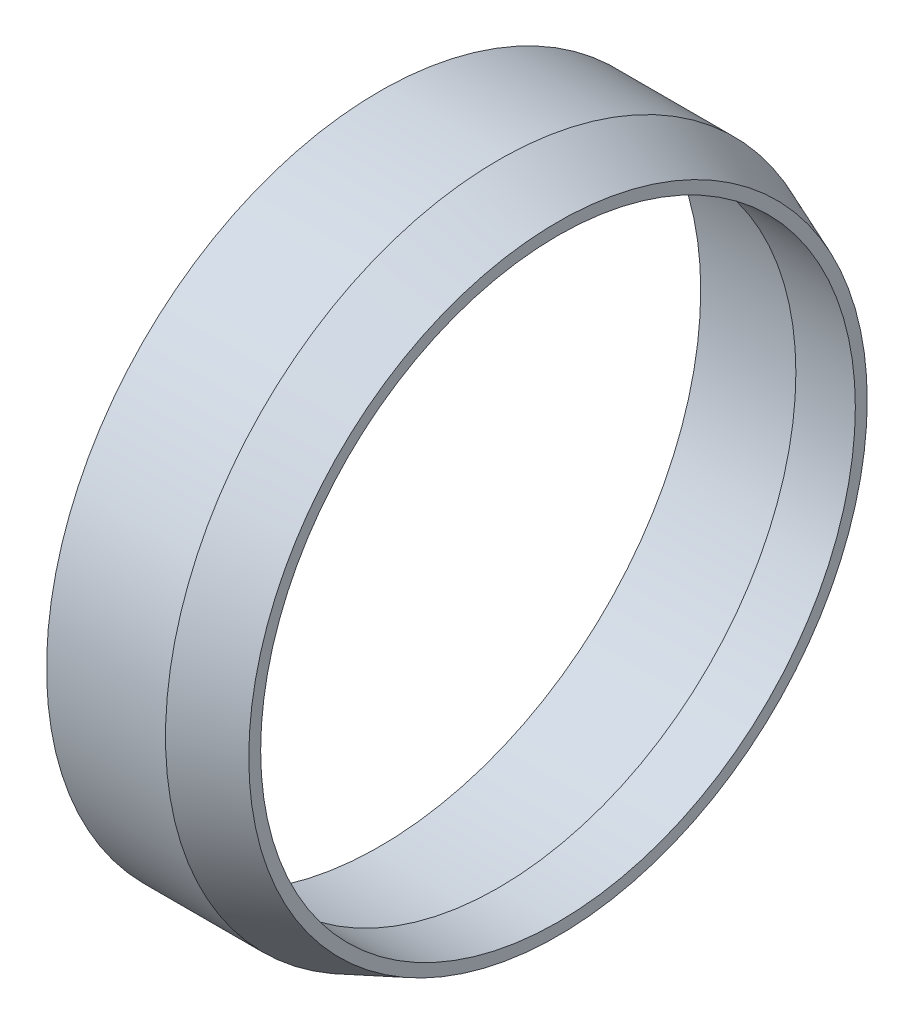
ISO-10303-21;
HEADER;
FILE_DESCRIPTION(('STEP AP214'),'2;1');
FILE_NAME('part.step','',(''),(''),'','','');
FILE_SCHEMA(('AUTOMOTIVE_DESIGN { 1 0 10303 214 1 1 1 1 }'));
ENDSEC;
DATA;
#1=APPLICATION_CONTEXT('core data for automotive mechanical design processes');
#2=APPLICATION_PROTOCOL_DEFINITION('international standard','automotive_design',2000,#1);
#3=PRODUCT_CONTEXT('',#1,'mechanical');
#4=PRODUCT('Part','Part','',(#3));
#5=PRODUCT_RELATED_PRODUCT_CATEGORY('part','',(#4));
#6=PRODUCT_DEFINITION_FORMATION('','',#4);
#7=PRODUCT_DEFINITION_CONTEXT('part definition',#1,'design');
#8=PRODUCT_DEFINITION('design','',#6,#7);
#9=PRODUCT_DEFINITION_SHAPE('','',#8);
#10=(LENGTH_UNIT() NAMED_UNIT(*) SI_UNIT(.MILLI.,.METRE.));
#11=(NAMED_UNIT(*) PLANE_ANGLE_UNIT() SI_UNIT($,.RADIAN.));
#12=(NAMED_UNIT(*) SI_UNIT($,.STERADIAN.) SOLID_ANGLE_UNIT());
#13=UNCERTAINTY_MEASURE_WITH_UNIT(LENGTH_MEASURE(1.E-05),#10,'distance_accuracy_value','');
#14=(GEOMETRIC_REPRESENTATION_CONTEXT(3) GLOBAL_UNCERTAINTY_ASSIGNED_CONTEXT((#13)) GLOBAL_UNIT_ASSIGNED_CONTEXT((#10,
#11,#12)) REPRESENTATION_CONTEXT('',''));
#15=CARTESIAN_POINT('',(0.,0.,0.));
#16=DIRECTION('',(0.,0.,1.));
#17=DIRECTION('',(1.,0.,0.));
#18=AXIS2_PLACEMENT_3D('',#15,#16,#17);
#19=CARTESIAN_POINT('',(37.9005030329932,0.,0.));
#20=DIRECTION('',(1.,0.,0.));
#21=DIRECTION('',(0.,0.,-1.));
#22=AXIS2_PLACEMENT_3D('',#19,#20,#21);
#23=CYLINDRICAL_SURFACE('',#22,25.);
#24=CARTESIAN_POINT('',(0.,0.,0.));
#25=DIRECTION('',(1.,0.,0.));
#26=DIRECTION('',(0.,0.,-1.));
#27=AXIS2_PLACEMENT_3D('',#24,#25,#26);
#28=CIRCLE('',#27,25.);
#29=CARTESIAN_POINT('',(0.,0.,-25.));
#30=VERTEX_POINT('',#29);
#31=EDGE_CURVE('E10',#30,#30,#28,.T.);
#32=ORIENTED_EDGE('',*,*,#31,.F.);
#33=EDGE_LOOP('',(#32));
#34=FACE_BOUND('',#33,.T.);
#35=CARTESIAN_POINT('',(5.,0.,0.));
#36=DIRECTION('',(1.,0.,0.));
#37=DIRECTION('',(0.,0.,-1.));
#38=AXIS2_PLACEMENT_3D('',#35,#36,#37);
#39=CIRCLE('',#38,25.);
#40=CARTESIAN_POINT('',(5.,0.,-25.));
#41=VERTEX_POINT('',#40);
#42=EDGE_CURVE('E56',#41,#41,#39,.T.);
#43=ORIENTED_EDGE('',*,*,#42,.T.);
#44=EDGE_LOOP('',(#43));
#45=FACE_BOUND('',#44,.T.);
#46=ADVANCED_FACE('F31',(#34,#45),#23,.F.);
#47=CARTESIAN_POINT('',(0.,0.,25.));
#48=DIRECTION('',(1.,0.,0.));
#49=DIRECTION('',(0.,0.,-1.));
#50=AXIS2_PLACEMENT_3D('',#47,#48,#49);
#51=PLANE('',#50);
#52=CARTESIAN_POINT('',(0.,0.,0.));
#53=DIRECTION('',(1.,0.,0.));
#54=DIRECTION('',(0.,0.,-1.));
#55=AXIS2_PLACEMENT_3D('',#52,#53,#54);
#56=CIRCLE('',#55,27.);
#57=CARTESIAN_POINT('',(0.,0.,-27.));
#58=VERTEX_POINT('',#57);
#59=EDGE_CURVE('E37',#58,#58,#56,.T.);
#60=ORIENTED_EDGE('',*,*,#59,.F.);
#61=EDGE_LOOP('',(#60));
#62=FACE_BOUND('',#61,.T.);
#63=ORIENTED_EDGE('',*,*,#31,.T.);
#64=EDGE_LOOP('',(#63));
#65=FACE_BOUND('',#64,.T.);
#66=ADVANCED_FACE('F87',(#62,#65),#51,.F.);
#67=CARTESIAN_POINT('',(37.9005030329932,0.,0.));
#68=DIRECTION('',(1.,0.,0.));
#69=DIRECTION('',(0.,0.,-1.));
#70=AXIS2_PLACEMENT_3D('',#67,#68,#69);
#71=CYLINDRICAL_SURFACE('',#70,27.);
#72=CARTESIAN_POINT('',(-9.99999999999999,0.,0.));
#73=DIRECTION('',(1.,0.,0.));
#74=DIRECTION('',(0.,0.,-1.));
#75=AXIS2_PLACEMENT_3D('',#72,#73,#74);
#76=CIRCLE('',#75,27.);
#77=CARTESIAN_POINT('',(-9.99999999999999,0.,-27.));
#78=VERTEX_POINT('',#77);
#79=EDGE_CURVE('E41',#78,#78,#76,.T.);
#80=ORIENTED_EDGE('',*,*,#79,.F.);
#81=EDGE_LOOP('',(#80));
#82=FACE_BOUND('',#81,.T.);
#83=ORIENTED_EDGE('',*,*,#59,.T.);
#84=EDGE_LOOP('',(#83));
#85=FACE_BOUND('',#84,.T.);
#86=ADVANCED_FACE('F82',(#82,#85),#71,.F.);
#87=CARTESIAN_POINT('',(-9.99999999999999,0.,27.));
#88=DIRECTION('',(1.,0.,0.));
#89=DIRECTION('',(0.,0.,-1.));
#90=AXIS2_PLACEMENT_3D('',#87,#88,#89);
#91=PLANE('',#90);
#92=CARTESIAN_POINT('',(-9.99999999999999,0.,0.));
#93=DIRECTION('',(1.,0.,0.));
#94=DIRECTION('',(0.,0.,-1.));
#95=AXIS2_PLACEMENT_3D('',#92,#93,#94);
#96=CIRCLE('',#95,28.);
#97=CARTESIAN_POINT('',(-9.99999999999999,0.,-28.));
#98=VERTEX_POINT('',#97);
#99=EDGE_CURVE('E45',#98,#98,#96,.T.);
#100=ORIENTED_EDGE('',*,*,#99,.F.);
#101=EDGE_LOOP('',(#100));
#102=FACE_BOUND('',#101,.T.);
#103=ORIENTED_EDGE('',*,*,#79,.T.);
#104=EDGE_LOOP('',(#103));
#105=FACE_BOUND('',#104,.T.);
#106=ADVANCED_FACE('F76',(#102,#105),#91,.F.);
#107=CARTESIAN_POINT('',(37.9005030329932,0.,0.));
#108=DIRECTION('',(1.,0.,0.));
#109=DIRECTION('',(0.,0.,-1.));
#110=AXIS2_PLACEMENT_3D('',#107,#108,#109);
#111=CYLINDRICAL_SURFACE('',#110,28.);
#112=CARTESIAN_POINT('',(0.,0.,0.));
#113=DIRECTION('',(1.,0.,0.));
#114=DIRECTION('',(0.,0.,-1.));
#115=AXIS2_PLACEMENT_3D('',#112,#113,#114);
#116=CIRCLE('',#115,28.);
#117=CARTESIAN_POINT('',(0.,0.,-28.));
#118=VERTEX_POINT('',#117);
#119=EDGE_CURVE('E50',#118,#118,#116,.T.);
#120=ORIENTED_EDGE('',*,*,#119,.F.);
#121=EDGE_LOOP('',(#120));
#122=FACE_BOUND('',#121,.T.);
#123=ORIENTED_EDGE('',*,*,#99,.T.);
#124=EDGE_LOOP('',(#123));
#125=FACE_BOUND('',#124,.T.);
#126=ADVANCED_FACE('F70',(#122,#125),#111,.T.);
#127=CARTESIAN_POINT('',(0.,0.,0.));
#128=DIRECTION('',(-1.,0.,0.));
#129=DIRECTION('',(0.,0.,1.));
#130=AXIS2_PLACEMENT_3D('',#127,#128,#129);
#131=CONICAL_SURFACE('',#130,28.,0.380506377112365);
#132=CARTESIAN_POINT('',(5.,0.,0.));
#133=DIRECTION('',(1.,0.,0.));
#134=DIRECTION('',(0.,0.,-1.));
#135=AXIS2_PLACEMENT_3D('',#132,#133,#134);
#136=CIRCLE('',#135,26.);
#137=CARTESIAN_POINT('',(5.,0.,-26.));
#138=VERTEX_POINT('',#137);
#139=EDGE_CURVE('E53',#138,#138,#136,.T.);
#140=ORIENTED_EDGE('',*,*,#139,.F.);
#141=EDGE_LOOP('',(#140));
#142=FACE_BOUND('',#141,.T.);
#143=ORIENTED_EDGE('',*,*,#119,.T.);
#144=EDGE_LOOP('',(#143));
#145=FACE_BOUND('',#144,.T.);
#146=ADVANCED_FACE('F64',(#142,#145),#131,.T.);
#147=CARTESIAN_POINT('',(5.,0.,26.));
#148=DIRECTION('',(-1.,0.,0.));
#149=DIRECTION('',(0.,0.,1.));
#150=AXIS2_PLACEMENT_3D('',#147,#148,#149);
#151=PLANE('',#150);
#152=ORIENTED_EDGE('',*,*,#42,.F.);
#153=EDGE_LOOP('',(#152));
#154=FACE_BOUND('',#153,.T.);
#155=ORIENTED_EDGE('',*,*,#139,.T.);
#156=EDGE_LOOP('',(#155));
#157=FACE_BOUND('',#156,.T.);
#158=ADVANCED_FACE('F61',(#154,#157),#151,.F.);
#159=CLOSED_SHELL('',(#46,#66,#86,#106,#126,#146,#158));
#160=MANIFOLD_SOLID_BREP('B2',#159);
#161=ADVANCED_BREP_SHAPE_REPRESENTATION('',(#18,#160),#14);
#162=SHAPE_DEFINITION_REPRESENTATION(#9,#161);
ENDSEC;
END-ISO-10303-21;
